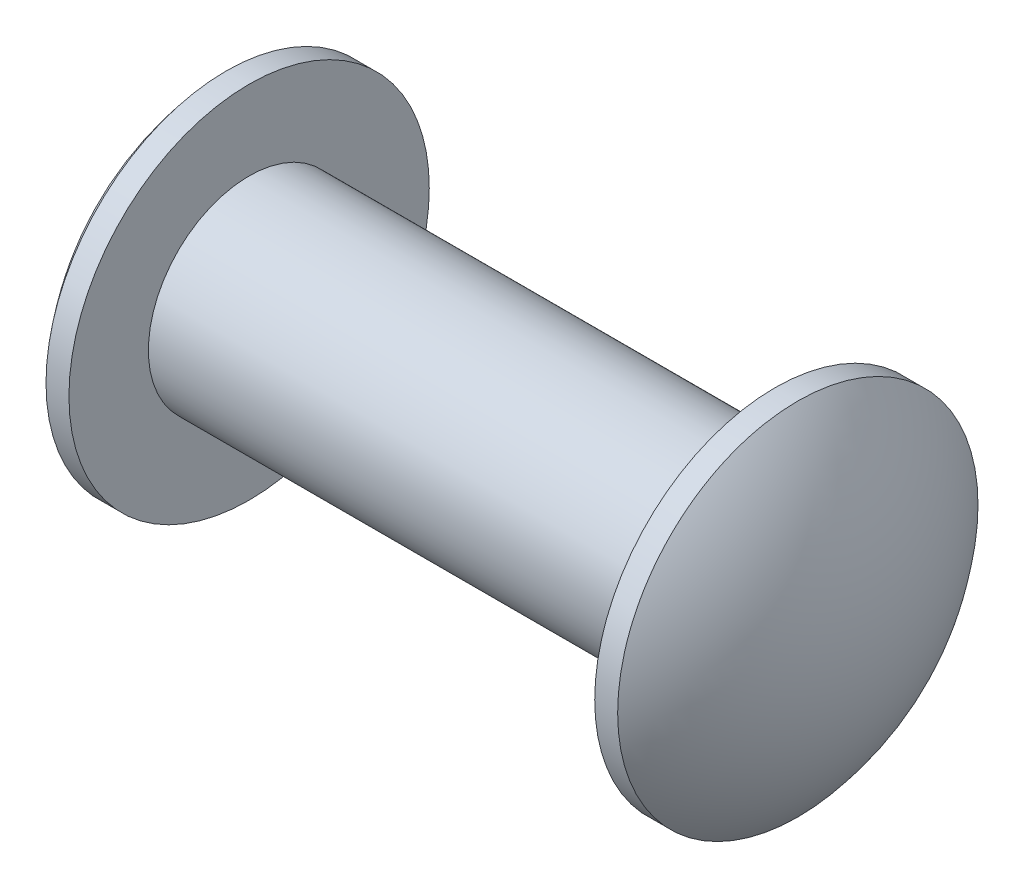
ISO-10303-21;
HEADER;
FILE_DESCRIPTION(('STEP AP214'),'2;1');
FILE_NAME('part.step','',(''),(''),'','','');
FILE_SCHEMA(('AUTOMOTIVE_DESIGN { 1 0 10303 214 1 1 1 1 }'));
ENDSEC;
DATA;
#1=APPLICATION_CONTEXT('core data for automotive mechanical design processes');
#2=APPLICATION_PROTOCOL_DEFINITION('international standard','automotive_design',2000,#1);
#3=PRODUCT_CONTEXT('',#1,'mechanical');
#4=PRODUCT('Part','Part','',(#3));
#5=PRODUCT_RELATED_PRODUCT_CATEGORY('part','',(#4));
#6=PRODUCT_DEFINITION_FORMATION('','',#4);
#7=PRODUCT_DEFINITION_CONTEXT('part definition',#1,'design');
#8=PRODUCT_DEFINITION('design','',#6,#7);
#9=PRODUCT_DEFINITION_SHAPE('','',#8);
#10=(LENGTH_UNIT() NAMED_UNIT(*) SI_UNIT(.MILLI.,.METRE.));
#11=(NAMED_UNIT(*) PLANE_ANGLE_UNIT() SI_UNIT($,.RADIAN.));
#12=(NAMED_UNIT(*) SI_UNIT($,.STERADIAN.) SOLID_ANGLE_UNIT());
#13=UNCERTAINTY_MEASURE_WITH_UNIT(LENGTH_MEASURE(1.E-05),#10,'distance_accuracy_value','');
#14=(GEOMETRIC_REPRESENTATION_CONTEXT(3) GLOBAL_UNCERTAINTY_ASSIGNED_CONTEXT((#13)) GLOBAL_UNIT_ASSIGNED_CONTEXT((#10,
#11,#12)) REPRESENTATION_CONTEXT('',''));
#15=CARTESIAN_POINT('',(0.,0.,0.));
#16=DIRECTION('',(0.,0.,1.));
#17=DIRECTION('',(1.,0.,0.));
#18=AXIS2_PLACEMENT_3D('',#15,#16,#17);
#19=CARTESIAN_POINT('',(-1.19602026760331,22.479,17.6445340506043));
#20=DIRECTION('',(0.539110810662423,0.616579551709967,0.573750111320287));
#21=DIRECTION('',(-0.811677417953638,0.562182978125638,0.158524661456518));
#22=AXIS2_PLACEMENT_3D('',#19,#20,#21);
#23=SPHERICAL_SURFACE('',#22,4.26974);
#24=CARTESIAN_POINT('',(-4.42468000000003,22.479,17.6445340506043));
#25=DIRECTION('',(1.,0.,0.));
#26=DIRECTION('',(0.,0.,-1.));
#27=AXIS2_PLACEMENT_3D('',#24,#25,#26);
#28=CIRCLE('',#27,2.794);
#29=CARTESIAN_POINT('',(-4.42468000000003,22.479,14.8505340506043));
#30=VERTEX_POINT('',#29);
#31=EDGE_CURVE('E19',#30,#30,#28,.T.);
#32=ORIENTED_EDGE('',*,*,#31,.F.);
#33=EDGE_LOOP('',(#32));
#34=FACE_BOUND('',#33,.T.);
#35=ADVANCED_FACE('F15',(#34),#23,.T.);
#36=CARTESIAN_POINT('',(1.21126026760325,22.479,17.6445340506043));
#37=DIRECTION('',(0.539110810662423,0.616579551709967,0.573750111320287));
#38=DIRECTION('',(0.726227580224672,-0.685322490161338,0.0540979315693344));
#39=AXIS2_PLACEMENT_3D('',#36,#37,#38);
#40=SPHERICAL_SURFACE('',#39,4.26974);
#41=CARTESIAN_POINT('',(4.43991999999996,22.479,17.6445340506043));
#42=DIRECTION('',(1.,0.,0.));
#43=DIRECTION('',(0.,0.,-1.));
#44=AXIS2_PLACEMENT_3D('',#41,#42,#43);
#45=CIRCLE('',#44,2.794);
#46=CARTESIAN_POINT('',(4.43991999999996,22.479,14.8505340506043));
#47=VERTEX_POINT('',#46);
#48=EDGE_CURVE('E37',#47,#47,#45,.F.);
#49=ORIENTED_EDGE('',*,*,#48,.F.);
#50=EDGE_LOOP('',(#49));
#51=FACE_BOUND('',#50,.T.);
#52=ADVANCED_FACE('F47',(#51),#40,.T.);
#53=CARTESIAN_POINT('',(-6.67055472599035,22.479,17.6445340506043));
#54=DIRECTION('',(1.,0.,0.));
#55=DIRECTION('',(0.,0.,-1.));
#56=AXIS2_PLACEMENT_3D('',#53,#54,#55);
#57=CYLINDRICAL_SURFACE('',#56,2.794);
#58=CARTESIAN_POINT('',(-4.06908000000004,22.479,17.6445340506043));
#59=DIRECTION('',(1.,0.,0.));
#60=DIRECTION('',(0.,0.,-1.));
#61=AXIS2_PLACEMENT_3D('',#58,#59,#60);
#62=CIRCLE('',#61,2.794);
#63=CARTESIAN_POINT('',(-4.06908000000004,22.479,14.8505340506043));
#64=VERTEX_POINT('',#63);
#65=EDGE_CURVE('E35',#64,#64,#62,.T.);
#66=ORIENTED_EDGE('',*,*,#65,.F.);
#67=EDGE_LOOP('',(#66));
#68=FACE_BOUND('',#67,.T.);
#69=ORIENTED_EDGE('',*,*,#31,.T.);
#70=EDGE_LOOP('',(#69));
#71=FACE_BOUND('',#70,.T.);
#72=ADVANCED_FACE('F44',(#68,#71),#57,.T.);
#73=CARTESIAN_POINT('',(-6.67055472599035,22.479,17.6445340506043));
#74=DIRECTION('',(1.,0.,0.));
#75=DIRECTION('',(0.,0.,-1.));
#76=AXIS2_PLACEMENT_3D('',#73,#74,#75);
#77=CYLINDRICAL_SURFACE('',#76,2.794);
#78=CARTESIAN_POINT('',(4.08431999999997,22.479,17.6445340506043));
#79=DIRECTION('',(1.,0.,0.));
#80=DIRECTION('',(0.,0.,-1.));
#81=AXIS2_PLACEMENT_3D('',#78,#79,#80);
#82=CIRCLE('',#81,2.794);
#83=CARTESIAN_POINT('',(4.08431999999997,22.479,14.8505340506043));
#84=VERTEX_POINT('',#83);
#85=EDGE_CURVE('E28',#84,#84,#82,.F.);
#86=ORIENTED_EDGE('',*,*,#85,.F.);
#87=EDGE_LOOP('',(#86));
#88=FACE_BOUND('',#87,.T.);
#89=ORIENTED_EDGE('',*,*,#48,.T.);
#90=EDGE_LOOP('',(#89));
#91=FACE_BOUND('',#90,.T.);
#92=ADVANCED_FACE('F65',(#88,#91),#77,.T.);
#93=CARTESIAN_POINT('',(-4.06908000000003,24.0411,17.6445340506043));
#94=DIRECTION('',(1.,0.,0.));
#95=DIRECTION('',(0.,0.,-1.));
#96=AXIS2_PLACEMENT_3D('',#93,#94,#95);
#97=PLANE('',#96);
#98=CARTESIAN_POINT('',(-4.06908000000003,22.479,17.6445340506043));
#99=DIRECTION('',(1.,0.,0.));
#100=DIRECTION('',(0.,0.,-1.));
#101=AXIS2_PLACEMENT_3D('',#98,#99,#100);
#102=CIRCLE('',#101,1.5621);
#103=CARTESIAN_POINT('',(-4.06908000000003,22.479,16.0824340506043));
#104=VERTEX_POINT('',#103);
#105=EDGE_CURVE('E23',#104,#104,#102,.T.);
#106=ORIENTED_EDGE('',*,*,#105,.F.);
#107=EDGE_LOOP('',(#106));
#108=FACE_BOUND('',#107,.T.);
#109=ORIENTED_EDGE('',*,*,#65,.T.);
#110=EDGE_LOOP('',(#109));
#111=FACE_BOUND('',#110,.T.);
#112=ADVANCED_FACE('F59',(#108,#111),#97,.T.);
#113=CARTESIAN_POINT('',(4.08431999999997,24.0411,17.6445340506043));
#114=DIRECTION('',(-1.,0.,0.));
#115=DIRECTION('',(0.,0.,1.));
#116=AXIS2_PLACEMENT_3D('',#113,#114,#115);
#117=PLANE('',#116);
#118=CARTESIAN_POINT('',(4.08431999999997,22.479,17.6445340506043));
#119=DIRECTION('',(1.,0.,0.));
#120=DIRECTION('',(0.,0.,-1.));
#121=AXIS2_PLACEMENT_3D('',#118,#119,#120);
#122=CIRCLE('',#121,1.5621);
#123=CARTESIAN_POINT('',(4.08431999999997,22.479,16.0824340506043));
#124=VERTEX_POINT('',#123);
#125=EDGE_CURVE('E10',#124,#124,#122,.F.);
#126=ORIENTED_EDGE('',*,*,#125,.F.);
#127=EDGE_LOOP('',(#126));
#128=FACE_BOUND('',#127,.T.);
#129=ORIENTED_EDGE('',*,*,#85,.T.);
#130=EDGE_LOOP('',(#129));
#131=FACE_BOUND('',#130,.T.);
#132=ADVANCED_FACE('F54',(#128,#131),#117,.T.);
#133=CARTESIAN_POINT('',(-6.67055472599035,22.479,17.6445340506043));
#134=DIRECTION('',(1.,0.,0.));
#135=DIRECTION('',(0.,0.,-1.));
#136=AXIS2_PLACEMENT_3D('',#133,#134,#135);
#137=CYLINDRICAL_SURFACE('',#136,1.5621);
#138=ORIENTED_EDGE('',*,*,#105,.T.);
#139=EDGE_LOOP('',(#138));
#140=FACE_BOUND('',#139,.T.);
#141=ORIENTED_EDGE('',*,*,#125,.T.);
#142=EDGE_LOOP('',(#141));
#143=FACE_BOUND('',#142,.T.);
#144=ADVANCED_FACE('F52',(#140,#143),#137,.T.);
#145=CLOSED_SHELL('',(#35,#52,#72,#92,#112,#132,#144));
#146=MANIFOLD_SOLID_BREP('B1',#145);
#147=ADVANCED_BREP_SHAPE_REPRESENTATION('',(#18,#146),#14);
#148=SHAPE_DEFINITION_REPRESENTATION(#9,#147);
ENDSEC;
END-ISO-10303-21;
